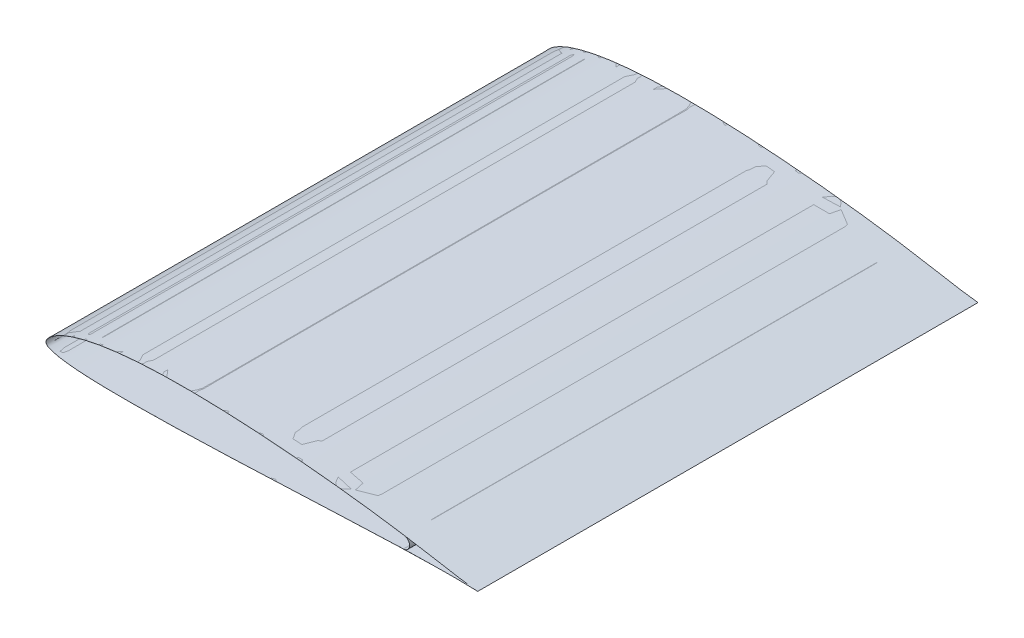
ISO-10303-21;
HEADER;
FILE_DESCRIPTION(('STEP AP214'),'2;1');
FILE_NAME('part.step','',(''),(''),'','','');
FILE_SCHEMA(('AUTOMOTIVE_DESIGN { 1 0 10303 214 1 1 1 1 }'));
ENDSEC;
DATA;
#1=APPLICATION_CONTEXT('core data for automotive mechanical design processes');
#2=APPLICATION_PROTOCOL_DEFINITION('international standard','automotive_design',2000,#1);
#3=PRODUCT_CONTEXT('',#1,'mechanical');
#4=PRODUCT('Part','Part','',(#3));
#5=PRODUCT_RELATED_PRODUCT_CATEGORY('part','',(#4));
#6=PRODUCT_DEFINITION_FORMATION('','',#4);
#7=PRODUCT_DEFINITION_CONTEXT('part definition',#1,'design');
#8=PRODUCT_DEFINITION('design','',#6,#7);
#9=PRODUCT_DEFINITION_SHAPE('','',#8);
#10=(LENGTH_UNIT() NAMED_UNIT(*) SI_UNIT(.MILLI.,.METRE.));
#11=(NAMED_UNIT(*) PLANE_ANGLE_UNIT() SI_UNIT($,.RADIAN.));
#12=(NAMED_UNIT(*) SI_UNIT($,.STERADIAN.) SOLID_ANGLE_UNIT());
#13=UNCERTAINTY_MEASURE_WITH_UNIT(LENGTH_MEASURE(1.E-05),#10,'distance_accuracy_value','');
#14=(GEOMETRIC_REPRESENTATION_CONTEXT(3) GLOBAL_UNCERTAINTY_ASSIGNED_CONTEXT((#13)) GLOBAL_UNIT_ASSIGNED_CONTEXT((#10,
#11,#12)) REPRESENTATION_CONTEXT('',''));
#15=CARTESIAN_POINT('',(0.,0.,0.));
#16=DIRECTION('',(0.,0.,1.));
#17=DIRECTION('',(1.,0.,0.));
#18=AXIS2_PLACEMENT_3D('',#15,#16,#17);
#19=CARTESIAN_POINT('',(0.314706289683715,6.90237845530344,177.8));
#20=DIRECTION('',(0.0455465742220417,0.998962216290804,0.));
#21=DIRECTION('',(-0.998962216290805,0.0455465742220417,0.));
#22=AXIS2_PLACEMENT_3D('',#19,#20,#21);
#23=PLANE('',#22);
#24=DIRECTION('',(0.998962216290805,-0.0455465742220417,0.));
#25=VECTOR('',#24,1.);
#26=CARTESIAN_POINT('',(0.314706289683715,6.90237845530344,0.));
#27=LINE('',#26,#25);
#28=CARTESIAN_POINT('',(151.897491473647,-0.00887050244030834,0.));
#29=VERTEX_POINT('',#28);
#30=CARTESIAN_POINT('',(153.379057906125,-0.0764208806040565,0.));
#31=VERTEX_POINT('',#30);
#32=EDGE_CURVE('E173',#29,#31,#27,.T.);
#33=ORIENTED_EDGE('',*,*,#32,.T.);
#34=DIRECTION('',(0.,0.,-1.));
#35=VECTOR('',#34,1.);
#36=CARTESIAN_POINT('',(153.379057906125,-0.0764208806040565,177.8));
#37=LINE('',#36,#35);
#38=CARTESIAN_POINT('',(153.379057906125,-0.0764208806040565,177.8));
#39=VERTEX_POINT('',#38);
#40=EDGE_CURVE('E11',#39,#31,#37,.T.);
#41=ORIENTED_EDGE('',*,*,#40,.F.);
#42=DIRECTION('',(0.998962216290805,-0.0455465742220417,0.));
#43=VECTOR('',#42,1.);
#44=CARTESIAN_POINT('',(0.314706289683715,6.90237845530344,177.8));
#45=LINE('',#44,#43);
#46=CARTESIAN_POINT('',(151.897491473647,-0.00887050244030834,177.8));
#47=VERTEX_POINT('',#46);
#48=EDGE_CURVE('E98',#47,#39,#45,.T.);
#49=ORIENTED_EDGE('',*,*,#48,.F.);
#50=DIRECTION('',(0.,0.,-1.));
#51=VECTOR('',#50,1.);
#52=CARTESIAN_POINT('',(151.897491473647,-0.00887050244030834,177.8));
#53=LINE('',#52,#51);
#54=EDGE_CURVE('E50',#47,#29,#53,.T.);
#55=ORIENTED_EDGE('',*,*,#54,.T.);
#56=EDGE_LOOP('',(#33,#41,#49,#55));
#57=FACE_BOUND('',#56,.T.);
#58=ADVANCED_FACE('F39',(#57),#23,.F.);
#59=CARTESIAN_POINT('',(152.4,0.,177.8));
#60=CARTESIAN_POINT('',(152.232833718495,0.0185024145844094,177.8));
#61=CARTESIAN_POINT('',(151.571843934071,0.0916625454276125,177.8));
#62=CARTESIAN_POINT('',(150.11399955714,0.283859600165364,177.8));
#63=CARTESIAN_POINT('',(147.749385864208,0.638650628689324,177.8));
#64=CARTESIAN_POINT('',(144.555943785527,1.17015700229937,177.8));
#65=CARTESIAN_POINT('',(140.615360499081,1.85909924705757,177.8));
#66=CARTESIAN_POINT('',(136.007834995224,2.67146012975516,177.8));
#67=CARTESIAN_POINT('',(130.806388018581,3.56284001663103,177.8));
#68=CARTESIAN_POINT('',(125.073826155466,4.48615477740971,177.8));
#69=CARTESIAN_POINT('',(118.8646901353,5.39775327756707,177.8));
#70=CARTESIAN_POINT('',(112.233312125261,6.27297423591478,177.8));
#71=CARTESIAN_POINT('',(105.243489487442,7.10605889156724,177.8));
#72=CARTESIAN_POINT('',(97.9696654062804,7.88931969327321,177.8));
#73=CARTESIAN_POINT('',(90.4927249927246,8.60673485806436,177.8));
#74=CARTESIAN_POINT('',(82.8952532405217,9.2406702507931,177.8));
#75=CARTESIAN_POINT('',(75.2586679023908,9.77749908015344,177.8));
#76=CARTESIAN_POINT('',(67.6629284232157,10.1988157178373,177.8));
#77=CARTESIAN_POINT('',(60.1868274986299,10.4917010195868,177.8));
#78=CARTESIAN_POINT('',(52.9059459542408,10.6450800985298,177.8));
#79=CARTESIAN_POINT('',(45.8917437129946,10.6445518064523,177.8));
#80=CARTESIAN_POINT('',(39.2106810479072,10.4862475970987,177.8));
#81=CARTESIAN_POINT('',(32.923263797137,10.1644127111138,177.8));
#82=CARTESIAN_POINT('',(27.0837008540271,9.67093972647032,177.8));
#83=CARTESIAN_POINT('',(21.737197539699,9.01650809069112,177.8));
#84=CARTESIAN_POINT('',(16.9243447592619,8.20408197388868,177.8));
#85=CARTESIAN_POINT('',(12.6762753048712,7.24977047946681,177.8));
#86=CARTESIAN_POINT('',(9.01981569255257,6.17445777095632,177.8));
#87=CARTESIAN_POINT('',(5.96569481917708,5.00201852215155,177.8));
#88=CARTESIAN_POINT('',(3.54403253695888,3.76987152616717,177.8));
#89=CARTESIAN_POINT('',(1.70483470840094,2.53149972603197,177.8));
#90=CARTESIAN_POINT('',(0.575239505776366,1.34473752883143,177.8));
#91=CARTESIAN_POINT('',(-0.170728015466049,0.203106959768801,177.8));
#92=CARTESIAN_POINT('',(0.337603285303623,-1.00177222805816,177.8));
#93=CARTESIAN_POINT('',(1.79294322608063,-1.54672679451716,177.8));
#94=CARTESIAN_POINT('',(3.794232234597,-2.17716445974196,177.8));
#95=CARTESIAN_POINT('',(6.64340020089969,-2.64392231576436,177.8));
#96=CARTESIAN_POINT('',(10.2161106536038,-3.04195363150428,177.8));
#97=CARTESIAN_POINT('',(14.5300841872538,-3.31987222771604,177.8));
#98=CARTESIAN_POINT('',(19.5339696288078,-3.49767725483492,177.8));
#99=CARTESIAN_POINT('',(25.1869220599411,-3.57763834503169,177.8));
#100=CARTESIAN_POINT('',(31.42862727455,-3.57384808178261,177.8));
#101=CARTESIAN_POINT('',(38.191948203283,-3.49658144160037,177.8));
#102=CARTESIAN_POINT('',(45.4015953170636,-3.34930898576548,177.8));
#103=CARTESIAN_POINT('',(52.9784172595709,-3.14184128811128,177.8));
#104=CARTESIAN_POINT('',(60.8386741403337,-2.88526226056694,177.8));
#105=CARTESIAN_POINT('',(68.8949884243473,-2.58793090460575,177.8));
#106=CARTESIAN_POINT('',(77.057432025165,-2.25888288701279,177.8));
#107=CARTESIAN_POINT('',(85.2350096722083,-1.90773028344113,177.8));
#108=CARTESIAN_POINT('',(93.3354268335371,-1.55016881909302,177.8));
#109=CARTESIAN_POINT('',(101.266049648543,-1.19546522084977,177.8));
#110=CARTESIAN_POINT('',(108.934170809505,-0.862411005508114,177.8));
#111=CARTESIAN_POINT('',(116.246498600348,-0.557504044589403,177.8));
#112=CARTESIAN_POINT('',(123.110150898588,-0.3069361826572,177.8));
#113=CARTESIAN_POINT('',(129.431690532645,-0.107922528146747,177.8));
#114=CARTESIAN_POINT('',(135.123521438346,0.0279744509983298,177.8));
#115=CARTESIAN_POINT('',(140.103603919286,0.108900524885163,177.8));
#116=CARTESIAN_POINT('',(144.299415419815,0.139938590331548,177.8));
#117=CARTESIAN_POINT('',(147.644768246445,0.124243060792821,177.8));
#118=CARTESIAN_POINT('',(150.083437285214,0.0865028877410205,177.8));
#119=CARTESIAN_POINT('',(151.399782071317,0.0403495604636981,177.8));
#120=CARTESIAN_POINT('',(151.898604,0.02286,177.8));
#121=B_SPLINE_CURVE_WITH_KNOTS('',3,(#59,#60,#61,#62,#63,#64,#65,#66,#67,#68,#69,#70,#71,#72,
#73,#74,#75,#76,#77,#78,#79,#80,#81,#82,#83,#84,#85,#86,#87,#88,#89,#90,#91,#92,#93,#94,#95,#96,
#97,#98,#99,#100,#101,#102,#103,#104,#105,#106,#107,#108,#109,#110,#111,#112,#113,#114,#115,
#116,#117,#118,#119,#120),.UNSPECIFIED.,.F.,.F.,(4,1,1,1,1,1,1,1,1,1,1,1,1,1,1,1,1,1,1,1,1,1,1,
1,1,1,1,1,1,1,1,1,1,1,1,1,1,1,1,1,1,1,1,1,1,1,1,1,1,1,1,1,1,1,1,1,1,1,1,4),(0.,
0.00163535583425865,0.00646633693476808,0.0142965918772176,0.0248842088552096,
0.0379439925510076,0.0531941368467982,0.0703765688743697,0.0892572179770476,0.109651763058439,
0.131396199224683,0.154294670265703,0.178096902835303,0.202530723472683,0.227328973387424,
0.25222580652472,0.276966075496197,0.301296827478668,0.324972088966137,0.347773045551505,
0.369493848961825,0.389946984550237,0.40897941596321,0.426465789850067,0.442306728816157,
0.456421239565711,0.46877353813753,0.47934514980936,0.488155641306995,0.495223141471028,
0.500608247512498,0.504417035913407,0.507344225330662,0.511892730711683,0.518766332626908,
0.528062399813873,0.5397504852938,0.553781923901918,0.570059197087642,0.588441486429501,
0.608747967256935,0.630750043644814,0.654207709776473,0.678865071069041,0.704450570233279,
0.73067750330715,0.757253936726054,0.783882586633168,0.810265561255861,0.836095192051152,
0.861073222293053,0.884896986100605,0.907258357413886,0.927856250220039,0.946394646161361,
0.962618153964165,0.976286171395788,0.987192827864271,0.995146789524168,1.),.UNSPECIFIED.);
#122=DIRECTION('',(0.,0.,-1.));
#123=VECTOR('',#122,1.);
#124=SURFACE_OF_LINEAR_EXTRUSION('',#121,#123);
#125=CARTESIAN_POINT('',(152.4,0.,0.));
#126=CARTESIAN_POINT('',(152.232833718495,0.0185024145844094,0.));
#127=CARTESIAN_POINT('',(151.571843934071,0.0916625454276125,0.));
#128=CARTESIAN_POINT('',(150.11399955714,0.283859600165364,0.));
#129=CARTESIAN_POINT('',(147.749385864208,0.638650628689324,0.));
#130=CARTESIAN_POINT('',(144.555943785527,1.17015700229937,0.));
#131=CARTESIAN_POINT('',(140.615360499081,1.85909924705757,0.));
#132=CARTESIAN_POINT('',(136.007834995224,2.67146012975516,0.));
#133=CARTESIAN_POINT('',(130.806388018581,3.56284001663103,0.));
#134=CARTESIAN_POINT('',(125.073826155466,4.48615477740971,0.));
#135=CARTESIAN_POINT('',(118.8646901353,5.39775327756707,0.));
#136=CARTESIAN_POINT('',(112.233312125261,6.27297423591478,0.));
#137=CARTESIAN_POINT('',(105.243489487442,7.10605889156724,0.));
#138=CARTESIAN_POINT('',(97.9696654062804,7.88931969327321,0.));
#139=CARTESIAN_POINT('',(90.4927249927246,8.60673485806436,0.));
#140=CARTESIAN_POINT('',(82.8952532405217,9.2406702507931,0.));
#141=CARTESIAN_POINT('',(75.2586679023908,9.77749908015344,0.));
#142=CARTESIAN_POINT('',(67.6629284232157,10.1988157178373,0.));
#143=CARTESIAN_POINT('',(60.1868274986299,10.4917010195868,0.));
#144=CARTESIAN_POINT('',(52.9059459542408,10.6450800985298,0.));
#145=CARTESIAN_POINT('',(45.8917437129946,10.6445518064523,0.));
#146=CARTESIAN_POINT('',(39.2106810479072,10.4862475970987,0.));
#147=CARTESIAN_POINT('',(32.923263797137,10.1644127111138,0.));
#148=CARTESIAN_POINT('',(27.0837008540271,9.67093972647032,0.));
#149=CARTESIAN_POINT('',(21.737197539699,9.01650809069112,0.));
#150=CARTESIAN_POINT('',(16.9243447592619,8.20408197388868,0.));
#151=CARTESIAN_POINT('',(12.6762753048712,7.24977047946681,0.));
#152=CARTESIAN_POINT('',(9.01981569255257,6.17445777095632,0.));
#153=CARTESIAN_POINT('',(5.96569481917708,5.00201852215155,0.));
#154=CARTESIAN_POINT('',(3.54403253695888,3.76987152616717,0.));
#155=CARTESIAN_POINT('',(1.70483470840094,2.53149972603197,0.));
#156=CARTESIAN_POINT('',(0.575239505776366,1.34473752883143,0.));
#157=CARTESIAN_POINT('',(-0.170728015466049,0.203106959768801,0.));
#158=CARTESIAN_POINT('',(0.337603285303623,-1.00177222805816,0.));
#159=CARTESIAN_POINT('',(1.79294322608063,-1.54672679451716,0.));
#160=CARTESIAN_POINT('',(3.794232234597,-2.17716445974196,0.));
#161=CARTESIAN_POINT('',(6.64340020089969,-2.64392231576436,0.));
#162=CARTESIAN_POINT('',(10.2161106536038,-3.04195363150428,0.));
#163=CARTESIAN_POINT('',(14.5300841872538,-3.31987222771604,0.));
#164=CARTESIAN_POINT('',(19.5339696288078,-3.49767725483492,0.));
#165=CARTESIAN_POINT('',(25.1869220599411,-3.57763834503169,0.));
#166=CARTESIAN_POINT('',(31.42862727455,-3.57384808178261,0.));
#167=CARTESIAN_POINT('',(38.191948203283,-3.49658144160037,0.));
#168=CARTESIAN_POINT('',(45.4015953170636,-3.34930898576548,0.));
#169=CARTESIAN_POINT('',(52.9784172595709,-3.14184128811128,0.));
#170=CARTESIAN_POINT('',(60.8386741403337,-2.88526226056694,0.));
#171=CARTESIAN_POINT('',(68.8949884243473,-2.58793090460575,0.));
#172=CARTESIAN_POINT('',(77.057432025165,-2.25888288701279,0.));
#173=CARTESIAN_POINT('',(85.2350096722083,-1.90773028344113,0.));
#174=CARTESIAN_POINT('',(93.3354268335371,-1.55016881909302,0.));
#175=CARTESIAN_POINT('',(101.266049648543,-1.19546522084977,0.));
#176=CARTESIAN_POINT('',(108.934170809505,-0.862411005508114,0.));
#177=CARTESIAN_POINT('',(116.246498600348,-0.557504044589403,0.));
#178=CARTESIAN_POINT('',(123.110150898588,-0.3069361826572,0.));
#179=CARTESIAN_POINT('',(129.431690532645,-0.107922528146747,0.));
#180=CARTESIAN_POINT('',(135.123521438346,0.0279744509983298,0.));
#181=CARTESIAN_POINT('',(140.103603919286,0.108900524885163,0.));
#182=CARTESIAN_POINT('',(144.299415419815,0.139938590331548,0.));
#183=CARTESIAN_POINT('',(147.644768246445,0.124243060792821,0.));
#184=CARTESIAN_POINT('',(150.083437285214,0.0865028877410205,0.));
#185=CARTESIAN_POINT('',(151.399782071317,0.0403495604636981,0.));
#186=CARTESIAN_POINT('',(151.898604,0.02286,0.));
#187=B_SPLINE_CURVE_WITH_KNOTS('',3,(#125,#126,#127,#128,#129,#130,#131,#132,#133,#134,#135,
#136,#137,#138,#139,#140,#141,#142,#143,#144,#145,#146,#147,#148,#149,#150,#151,#152,#153,#154,
#155,#156,#157,#158,#159,#160,#161,#162,#163,#164,#165,#166,#167,#168,#169,#170,#171,#172,#173,
#174,#175,#176,#177,#178,#179,#180,#181,#182,#183,#184,#185,#186),.UNSPECIFIED.,.F.,.F.,(4,1,1,
1,1,1,1,1,1,1,1,1,1,1,1,1,1,1,1,1,1,1,1,1,1,1,1,1,1,1,1,1,1,1,1,1,1,1,1,1,1,1,1,1,1,1,1,1,1,1,1,
1,1,1,1,1,1,1,1,4),(0.,0.00163535583425865,0.00646633693476808,0.0142965918772176,
0.0248842088552096,0.0379439925510076,0.0531941368467982,0.0703765688743697,0.0892572179770476,
0.109651763058439,0.131396199224683,0.154294670265703,0.178096902835303,0.202530723472683,
0.227328973387424,0.25222580652472,0.276966075496197,0.301296827478668,0.324972088966137,
0.347773045551505,0.369493848961825,0.389946984550237,0.40897941596321,0.426465789850067,
0.442306728816157,0.456421239565711,0.46877353813753,0.47934514980936,0.488155641306995,
0.495223141471028,0.500608247512498,0.504417035913407,0.507344225330662,0.511892730711683,
0.518766332626908,0.528062399813873,0.5397504852938,0.553781923901918,0.570059197087642,
0.588441486429501,0.608747967256935,0.630750043644814,0.654207709776473,0.678865071069041,
0.704450570233279,0.73067750330715,0.757253936726054,0.783882586633168,0.810265561255861,
0.836095192051152,0.861073222293053,0.884896986100605,0.907258357413886,0.927856250220039,
0.946394646161361,0.962618153964165,0.976286171395788,0.987192827864271,0.995146789524168,1.),.UNSPECIFIED.);
#188=CARTESIAN_POINT('',(127.340115100334,4.11729157022793,0.));
#189=VERTEX_POINT('',#188);
#190=CARTESIAN_POINT('',(127.,-0.186531366066512,0.));
#191=VERTEX_POINT('',#190);
#192=EDGE_CURVE('E109',#189,#191,#187,.T.);
#193=ORIENTED_EDGE('',*,*,#192,.F.);
#194=DIRECTION('',(0.,0.,-1.));
#195=VECTOR('',#194,1.);
#196=CARTESIAN_POINT('',(127.340115100334,4.11729157022793,177.8));
#197=LINE('',#196,#195);
#198=CARTESIAN_POINT('',(127.340115100334,4.11729157022793,177.8));
#199=VERTEX_POINT('',#198);
#200=EDGE_CURVE('E44',#199,#189,#197,.T.);
#201=ORIENTED_EDGE('',*,*,#200,.F.);
#202=CARTESIAN_POINT('',(127.,-0.186531366066512,177.8));
#203=VERTEX_POINT('',#202);
#204=EDGE_CURVE('E95',#199,#203,#121,.T.);
#205=ORIENTED_EDGE('',*,*,#204,.T.);
#206=DIRECTION('',(0.,0.,-1.));
#207=VECTOR('',#206,1.);
#208=CARTESIAN_POINT('',(127.,-0.186531366066512,177.8));
#209=LINE('',#208,#207);
#210=EDGE_CURVE('E88',#203,#191,#209,.T.);
#211=ORIENTED_EDGE('',*,*,#210,.T.);
#212=EDGE_LOOP('',(#193,#201,#205,#211));
#213=FACE_BOUND('',#212,.T.);
#214=ADVANCED_FACE('F41',(#213),#124,.T.);
#215=CARTESIAN_POINT('',(127.,1.97881911702013,177.8));
#216=DIRECTION('',(0.,0.,-1.));
#217=DIRECTION('',(-1.,0.,0.));
#218=AXIS2_PLACEMENT_3D('',#215,#216,#217);
#219=CYLINDRICAL_SURFACE('',#218,2.16535048308665);
#220=CARTESIAN_POINT('',(127.,1.97881911702013,0.));
#221=DIRECTION('',(0.,0.,1.));
#222=DIRECTION('',(1.,0.,0.));
#223=AXIS2_PLACEMENT_3D('',#220,#221,#222);
#224=CIRCLE('',#223,2.16535048308665);
#225=EDGE_CURVE('E93',#191,#189,#224,.T.);
#226=ORIENTED_EDGE('',*,*,#225,.F.);
#227=ORIENTED_EDGE('',*,*,#210,.F.);
#228=CARTESIAN_POINT('',(127.,1.97881911702013,177.8));
#229=DIRECTION('',(0.,0.,1.));
#230=DIRECTION('',(1.,0.,0.));
#231=AXIS2_PLACEMENT_3D('',#228,#229,#230);
#232=CIRCLE('',#231,2.16535048308665);
#233=EDGE_CURVE('E91',#203,#199,#232,.T.);
#234=ORIENTED_EDGE('',*,*,#233,.T.);
#235=ORIENTED_EDGE('',*,*,#200,.T.);
#236=EDGE_LOOP('',(#226,#227,#234,#235));
#237=FACE_BOUND('',#236,.T.);
#238=ADVANCED_FACE('F89',(#237),#219,.F.);
#239=CARTESIAN_POINT('',(153.379057906125,-0.0764208806040574,177.8));
#240=CARTESIAN_POINT('',(151.777403650408,0.100854529205895,177.8));
#241=CARTESIAN_POINT('',(148.580541304848,0.515918063962211,177.8));
#242=CARTESIAN_POINT('',(142.224453045665,1.60251453359923,177.8));
#243=CARTESIAN_POINT('',(134.289640849892,3.01778639685554,177.8));
#244=CARTESIAN_POINT('',(124.745166455803,4.59255920701022,177.8));
#245=CARTESIAN_POINT('',(111.973486471215,6.39462663008886,177.8));
#246=CARTESIAN_POINT('',(99.1560617295312,7.84069380363724,177.8));
#247=CARTESIAN_POINT('',(86.3117778330997,9.00951971702994,177.8));
#248=CARTESIAN_POINT('',(76.665367852004,9.72931795071594,177.8));
#249=CARTESIAN_POINT('',(67.0073410327352,10.27431231992,177.8));
#250=CARTESIAN_POINT('',(57.3397046184626,10.6177181734898,177.8));
#251=CARTESIAN_POINT('',(47.6659718639557,10.7159151022704,177.8));
#252=CARTESIAN_POINT('',(39.6051079665815,10.5423891729626,177.8));
#253=CARTESIAN_POINT('',(33.164323292629,10.1997300044598,177.8));
#254=CARTESIAN_POINT('',(28.3418316329226,9.81659917564033,177.8));
#255=CARTESIAN_POINT('',(23.5326083559802,9.28697463297126,177.8));
#256=CARTESIAN_POINT('',(18.7467685279039,8.57271479599354,177.8));
#257=CARTESIAN_POINT('',(14.7913329017154,7.7794561994551,177.8));
#258=CARTESIAN_POINT('',(11.6643407763204,6.98370467297474,177.8));
#259=CARTESIAN_POINT('',(9.34626787097601,6.28873342418453,177.8));
#260=CARTESIAN_POINT('',(7.06367091486696,5.47188684711001,177.8));
#261=CARTESIAN_POINT('',(5.21709044121481,4.66052238998179,177.8));
#262=CARTESIAN_POINT('',(3.79163352008069,3.90403470648921,177.8));
#263=CARTESIAN_POINT('',(2.74651346867247,3.27361843338787,177.8));
#264=CARTESIAN_POINT('',(1.75843885838669,2.56061295533518,177.8));
#265=CARTESIAN_POINT('',(1.03487186821548,1.88022323345933,177.8));
#266=CARTESIAN_POINT('',(0.510493424258131,1.25220470623516,177.8));
#267=CARTESIAN_POINT('',(0.128360776698362,0.727277365397701,177.8));
#268=CARTESIAN_POINT('',(-0.0881481425419476,0.143121397400388,177.8));
#269=CARTESIAN_POINT('',(0.0691341225482304,-0.49611805953647,177.8));
#270=CARTESIAN_POINT('',(0.475877127320221,-0.99518870456048,177.8));
#271=CARTESIAN_POINT('',(1.0162112417362,-1.29128234483354,177.8));
#272=CARTESIAN_POINT('',(1.60953567848298,-1.50116404055979,177.8));
#273=CARTESIAN_POINT('',(2.38122442983344,-1.76339646379978,177.8));
#274=CARTESIAN_POINT('',(3.3379701705538,-2.0493151447466,177.8));
#275=CARTESIAN_POINT('',(4.51335122832853,-2.3146076024554,177.8));
#276=CARTESIAN_POINT('',(5.71124511383787,-2.5185416427951,177.8));
#277=CARTESIAN_POINT('',(7.31450951441105,-2.74404487192381,177.8));
#278=CARTESIAN_POINT('',(9.31494725861107,-2.97189855142449,177.8));
#279=CARTESIAN_POINT('',(11.7245141709957,-3.17115008500391,177.8));
#280=CARTESIAN_POINT('',(14.1404431154105,-3.31551221642237,177.8));
#281=CARTESIAN_POINT('',(17.3622544293789,-3.45855735386383,177.8));
#282=CARTESIAN_POINT('',(21.3912598062271,-3.56265291802684,177.8));
#283=CARTESIAN_POINT('',(26.228077196067,-3.60919537648877,177.8));
#284=CARTESIAN_POINT('',(31.0644515917783,-3.60250576242219,177.8));
#285=CARTESIAN_POINT('',(37.512729928149,-3.54100364190557,177.8));
#286=CARTESIAN_POINT('',(45.5718173874165,-3.38269381597468,177.8));
#287=CARTESIAN_POINT('',(55.2404235739303,-3.10688168987836,177.8));
#288=CARTESIAN_POINT('',(64.9071063055517,-2.77299371041959,177.8));
#289=CARTESIAN_POINT('',(77.7937696590381,-2.26868797788801,177.8));
#290=CARTESIAN_POINT('',(93.8987191194809,-1.55952939336557,177.8));
#291=CARTESIAN_POINT('',(113.223428672497,-0.688177567733742,177.8));
#292=CARTESIAN_POINT('',(129.333517620957,-0.104429619065512,177.8));
#293=CARTESIAN_POINT('',(142.227418778696,0.124949385735485,177.8));
#294=CARTESIAN_POINT('',(148.676084166077,0.104077615202907,177.8));
#295=CARTESIAN_POINT('',(151.897491473647,-0.00887050244030986,177.8));
#296=B_SPLINE_CURVE_WITH_KNOTS('',3,(#239,#240,#241,#242,#243,#244,#245,#246,#247,#248,#249,
#250,#251,#252,#253,#254,#255,#256,#257,#258,#259,#260,#261,#262,#263,#264,#265,#266,#267,#268,
#269,#270,#271,#272,#273,#274,#275,#276,#277,#278,#279,#280,#281,#282,#283,#284,#285,#286,#287,
#288,#289,#290,#291,#292,#293,#294,#295),.UNSPECIFIED.,.F.,.F.,(4,1,1,1,1,1,1,1,1,1,1,1,1,1,1,1,
1,1,1,1,1,1,1,1,1,1,1,1,1,1,1,1,1,1,1,1,1,1,1,1,1,1,1,1,1,1,1,1,1,1,1,1,1,1,4),
(-0.00318125561093852,0.0124934515079824,0.0281681586269033,0.0595175728647451,
0.090866987102587,0.122216401340429,0.184915229816112,0.216264644053954,0.247614058291796,
0.278963472529638,0.31031288676748,0.341662301005322,0.373011715243163,0.388686422362084,
0.404361129481005,0.420035836599926,0.435710543718847,0.451385250837768,0.459222604397229,
0.467059957956689,0.474897311516149,0.48273466507561,0.48665334185534,0.49057201863507,
0.494490695414801,0.498409372194531,0.500368710584396,0.502328048974261,0.504287387364126,
0.506246725753991,0.508206064143856,0.510165402533721,0.512124740923587,0.514084079313452,
0.518002756093182,0.521921432872912,0.525840109652642,0.529758786432373,0.537596139991833,
0.545433493551293,0.553270847110754,0.561108200670214,0.576782907789135,0.592457614908056,
0.608132322026977,0.623807029145898,0.65515644338374,0.686505857621582,0.717855271859424,
0.749204686097265,0.811903514572949,0.874602343048633,0.937301171524316,0.968650585762158,1.),.UNSPECIFIED.);
#297=DIRECTION('',(0.,0.,-1.));
#298=VECTOR('',#297,1.);
#299=SURFACE_OF_LINEAR_EXTRUSION('',#296,#298);
#300=CARTESIAN_POINT('',(153.379057906125,-0.0764208806040574,0.));
#301=CARTESIAN_POINT('',(151.777403650408,0.100854529205895,0.));
#302=CARTESIAN_POINT('',(148.580541304848,0.515918063962211,0.));
#303=CARTESIAN_POINT('',(142.224453045665,1.60251453359923,0.));
#304=CARTESIAN_POINT('',(134.289640849892,3.01778639685554,0.));
#305=CARTESIAN_POINT('',(124.745166455803,4.59255920701022,0.));
#306=CARTESIAN_POINT('',(111.973486471215,6.39462663008886,0.));
#307=CARTESIAN_POINT('',(99.1560617295312,7.84069380363724,0.));
#308=CARTESIAN_POINT('',(86.3117778330997,9.00951971702994,0.));
#309=CARTESIAN_POINT('',(76.665367852004,9.72931795071594,0.));
#310=CARTESIAN_POINT('',(67.0073410327352,10.27431231992,0.));
#311=CARTESIAN_POINT('',(57.3397046184626,10.6177181734898,0.));
#312=CARTESIAN_POINT('',(47.6659718639557,10.7159151022704,0.));
#313=CARTESIAN_POINT('',(39.6051079665815,10.5423891729626,0.));
#314=CARTESIAN_POINT('',(33.164323292629,10.1997300044598,0.));
#315=CARTESIAN_POINT('',(28.3418316329226,9.81659917564033,0.));
#316=CARTESIAN_POINT('',(23.5326083559802,9.28697463297126,0.));
#317=CARTESIAN_POINT('',(18.7467685279039,8.57271479599354,0.));
#318=CARTESIAN_POINT('',(14.7913329017154,7.7794561994551,0.));
#319=CARTESIAN_POINT('',(11.6643407763204,6.98370467297474,0.));
#320=CARTESIAN_POINT('',(9.34626787097601,6.28873342418453,0.));
#321=CARTESIAN_POINT('',(7.06367091486696,5.47188684711001,0.));
#322=CARTESIAN_POINT('',(5.21709044121481,4.66052238998179,0.));
#323=CARTESIAN_POINT('',(3.79163352008069,3.90403470648921,0.));
#324=CARTESIAN_POINT('',(2.74651346867247,3.27361843338787,0.));
#325=CARTESIAN_POINT('',(1.75843885838669,2.56061295533518,0.));
#326=CARTESIAN_POINT('',(1.03487186821548,1.88022323345933,0.));
#327=CARTESIAN_POINT('',(0.510493424258131,1.25220470623516,0.));
#328=CARTESIAN_POINT('',(0.128360776698362,0.727277365397701,0.));
#329=CARTESIAN_POINT('',(-0.0881481425419476,0.143121397400388,0.));
#330=CARTESIAN_POINT('',(0.0691341225482304,-0.49611805953647,0.));
#331=CARTESIAN_POINT('',(0.475877127320221,-0.99518870456048,0.));
#332=CARTESIAN_POINT('',(1.0162112417362,-1.29128234483354,0.));
#333=CARTESIAN_POINT('',(1.60953567848298,-1.50116404055979,0.));
#334=CARTESIAN_POINT('',(2.38122442983344,-1.76339646379978,0.));
#335=CARTESIAN_POINT('',(3.3379701705538,-2.0493151447466,0.));
#336=CARTESIAN_POINT('',(4.51335122832853,-2.3146076024554,0.));
#337=CARTESIAN_POINT('',(5.71124511383787,-2.5185416427951,0.));
#338=CARTESIAN_POINT('',(7.31450951441105,-2.74404487192381,0.));
#339=CARTESIAN_POINT('',(9.31494725861107,-2.97189855142449,0.));
#340=CARTESIAN_POINT('',(11.7245141709957,-3.17115008500391,0.));
#341=CARTESIAN_POINT('',(14.1404431154105,-3.31551221642237,0.));
#342=CARTESIAN_POINT('',(17.3622544293789,-3.45855735386383,0.));
#343=CARTESIAN_POINT('',(21.3912598062271,-3.56265291802684,0.));
#344=CARTESIAN_POINT('',(26.228077196067,-3.60919537648877,0.));
#345=CARTESIAN_POINT('',(31.0644515917783,-3.60250576242219,0.));
#346=CARTESIAN_POINT('',(37.512729928149,-3.54100364190557,0.));
#347=CARTESIAN_POINT('',(45.5718173874165,-3.38269381597468,0.));
#348=CARTESIAN_POINT('',(55.2404235739303,-3.10688168987836,0.));
#349=CARTESIAN_POINT('',(64.9071063055517,-2.77299371041959,0.));
#350=CARTESIAN_POINT('',(77.7937696590381,-2.26868797788801,0.));
#351=CARTESIAN_POINT('',(93.8987191194809,-1.55952939336557,0.));
#352=CARTESIAN_POINT('',(113.223428672497,-0.688177567733742,0.));
#353=CARTESIAN_POINT('',(129.333517620957,-0.104429619065512,0.));
#354=CARTESIAN_POINT('',(142.227418778696,0.124949385735485,0.));
#355=CARTESIAN_POINT('',(148.676084166077,0.104077615202907,0.));
#356=CARTESIAN_POINT('',(151.897491473647,-0.00887050244030986,0.));
#357=B_SPLINE_CURVE_WITH_KNOTS('',3,(#300,#301,#302,#303,#304,#305,#306,#307,#308,#309,#310,
#311,#312,#313,#314,#315,#316,#317,#318,#319,#320,#321,#322,#323,#324,#325,#326,#327,#328,#329,
#330,#331,#332,#333,#334,#335,#336,#337,#338,#339,#340,#341,#342,#343,#344,#345,#346,#347,#348,
#349,#350,#351,#352,#353,#354,#355,#356),.UNSPECIFIED.,.F.,.F.,(4,1,1,1,1,1,1,1,1,1,1,1,1,1,1,1,
1,1,1,1,1,1,1,1,1,1,1,1,1,1,1,1,1,1,1,1,1,1,1,1,1,1,1,1,1,1,1,1,1,1,1,1,1,1,4),
(-0.00318125561093852,0.0124934515079824,0.0281681586269033,0.0595175728647451,
0.090866987102587,0.122216401340429,0.184915229816112,0.216264644053954,0.247614058291796,
0.278963472529638,0.31031288676748,0.341662301005322,0.373011715243163,0.388686422362084,
0.404361129481005,0.420035836599926,0.435710543718847,0.451385250837768,0.459222604397229,
0.467059957956689,0.474897311516149,0.48273466507561,0.48665334185534,0.49057201863507,
0.494490695414801,0.498409372194531,0.500368710584396,0.502328048974261,0.504287387364126,
0.506246725753991,0.508206064143856,0.510165402533721,0.512124740923587,0.514084079313452,
0.518002756093182,0.521921432872912,0.525840109652642,0.529758786432373,0.537596139991833,
0.545433493551293,0.553270847110754,0.561108200670214,0.576782907789135,0.592457614908056,
0.608132322026977,0.623807029145898,0.65515644338374,0.686505857621582,0.717855271859424,
0.749204686097265,0.811903514572949,0.874602343048633,0.937301171524316,0.968650585762158,1.),.UNSPECIFIED.);
#358=EDGE_CURVE('E74',#31,#29,#357,.T.);
#359=ORIENTED_EDGE('',*,*,#358,.T.);
#360=ORIENTED_EDGE('',*,*,#54,.F.);
#361=EDGE_CURVE('E58',#39,#47,#296,.T.);
#362=ORIENTED_EDGE('',*,*,#361,.F.);
#363=ORIENTED_EDGE('',*,*,#40,.T.);
#364=EDGE_LOOP('',(#359,#360,#362,#363));
#365=FACE_BOUND('',#364,.T.);
#366=ADVANCED_FACE('F117',(#365),#299,.F.);
#367=CARTESIAN_POINT('',(0.,0.,177.8));
#368=DIRECTION('',(0.,0.,1.));
#369=DIRECTION('',(1.,0.,0.));
#370=AXIS2_PLACEMENT_3D('',#367,#368,#369);
#371=PLANE('',#370);
#372=ORIENTED_EDGE('',*,*,#204,.F.);
#373=ORIENTED_EDGE('',*,*,#233,.F.);
#374=EDGE_LOOP('',(#372,#373));
#375=FACE_BOUND('',#374,.T.);
#376=ORIENTED_EDGE('',*,*,#48,.T.);
#377=ORIENTED_EDGE('',*,*,#361,.T.);
#378=EDGE_LOOP('',(#376,#377));
#379=FACE_BOUND('',#378,.T.);
#380=ADVANCED_FACE('F97',(#375,#379),#371,.T.);
#381=CARTESIAN_POINT('',(0.,0.,0.));
#382=DIRECTION('',(0.,0.,1.));
#383=DIRECTION('',(1.,0.,0.));
#384=AXIS2_PLACEMENT_3D('',#381,#382,#383);
#385=PLANE('',#384);
#386=ORIENTED_EDGE('',*,*,#192,.T.);
#387=ORIENTED_EDGE('',*,*,#225,.T.);
#388=EDGE_LOOP('',(#386,#387));
#389=FACE_BOUND('',#388,.T.);
#390=ORIENTED_EDGE('',*,*,#32,.F.);
#391=ORIENTED_EDGE('',*,*,#358,.F.);
#392=EDGE_LOOP('',(#390,#391));
#393=FACE_BOUND('',#392,.T.);
#394=ADVANCED_FACE('F121',(#389,#393),#385,.F.);
#395=CLOSED_SHELL('',(#58,#214,#238,#366,#380,#394));
#396=MANIFOLD_SOLID_BREP('B2',#395);
#397=ADVANCED_BREP_SHAPE_REPRESENTATION('',(#18,#396),#14);
#398=SHAPE_DEFINITION_REPRESENTATION(#9,#397);
ENDSEC;
END-ISO-10303-21;
